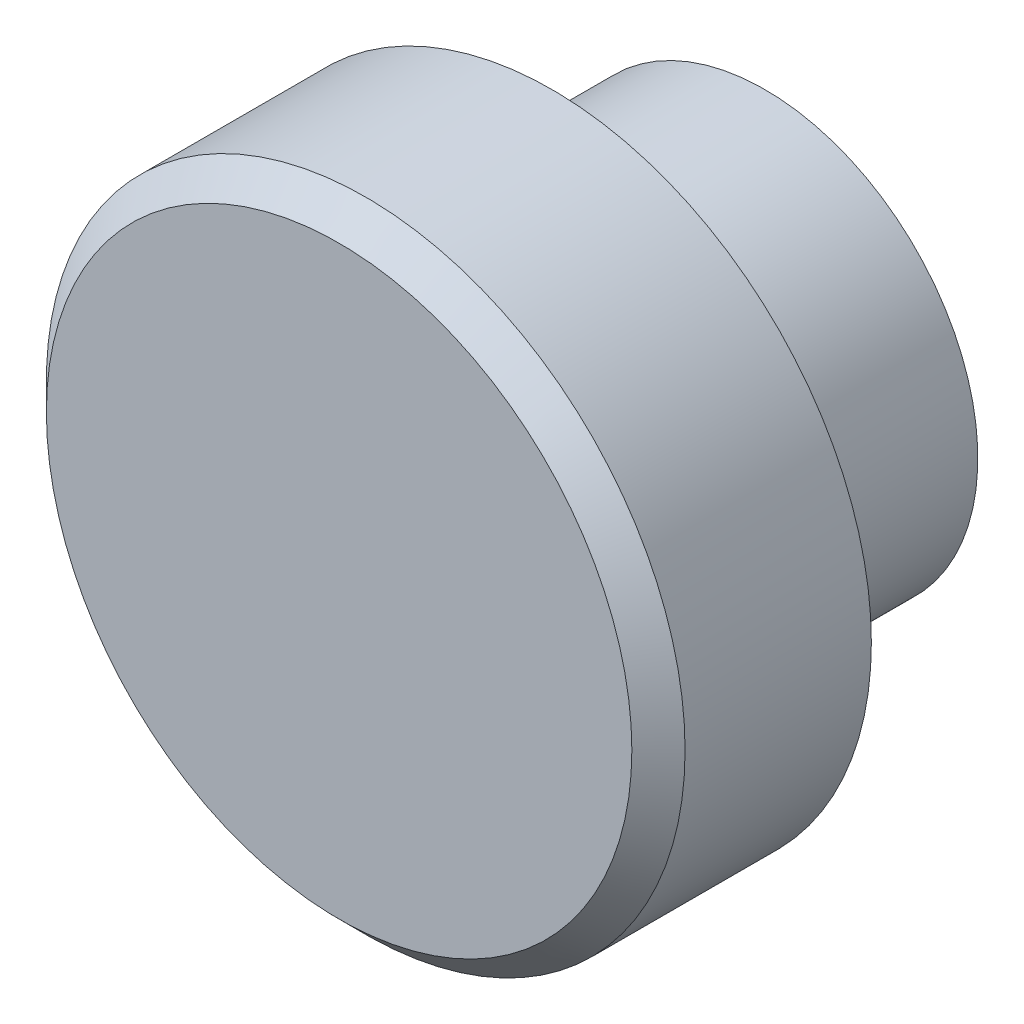
ISO-10303-21;
HEADER;
FILE_DESCRIPTION(('STEP AP214'),'2;1');
FILE_NAME('part.step','',(''),(''),'','','');
FILE_SCHEMA(('AUTOMOTIVE_DESIGN { 1 0 10303 214 1 1 1 1 }'));
ENDSEC;
DATA;
#1=APPLICATION_CONTEXT('core data for automotive mechanical design processes');
#2=APPLICATION_PROTOCOL_DEFINITION('international standard','automotive_design',2000,#1);
#3=PRODUCT_CONTEXT('',#1,'mechanical');
#4=PRODUCT('Part','Part','',(#3));
#5=PRODUCT_RELATED_PRODUCT_CATEGORY('part','',(#4));
#6=PRODUCT_DEFINITION_FORMATION('','',#4);
#7=PRODUCT_DEFINITION_CONTEXT('part definition',#1,'design');
#8=PRODUCT_DEFINITION('design','',#6,#7);
#9=PRODUCT_DEFINITION_SHAPE('','',#8);
#10=(LENGTH_UNIT() NAMED_UNIT(*) SI_UNIT(.MILLI.,.METRE.));
#11=(NAMED_UNIT(*) PLANE_ANGLE_UNIT() SI_UNIT($,.RADIAN.));
#12=(NAMED_UNIT(*) SI_UNIT($,.STERADIAN.) SOLID_ANGLE_UNIT());
#13=UNCERTAINTY_MEASURE_WITH_UNIT(LENGTH_MEASURE(1.E-05),#10,'distance_accuracy_value','');
#14=(GEOMETRIC_REPRESENTATION_CONTEXT(3) GLOBAL_UNCERTAINTY_ASSIGNED_CONTEXT((#13)) GLOBAL_UNIT_ASSIGNED_CONTEXT((#10,
#11,#12)) REPRESENTATION_CONTEXT('',''));
#15=CARTESIAN_POINT('',(0.,0.,0.));
#16=DIRECTION('',(0.,0.,1.));
#17=DIRECTION('',(1.,0.,0.));
#18=AXIS2_PLACEMENT_3D('',#15,#16,#17);
#19=CARTESIAN_POINT('',(0.,0.,8.));
#20=DIRECTION('',(0.,0.,-1.));
#21=DIRECTION('',(-1.,0.,0.));
#22=AXIS2_PLACEMENT_3D('',#19,#20,#21);
#23=CYLINDRICAL_SURFACE('',#22,12.);
#24=CARTESIAN_POINT('',(0.,0.,7.00000000000001));
#25=DIRECTION('',(0.,0.,1.));
#26=DIRECTION('',(1.,0.,0.));
#27=AXIS2_PLACEMENT_3D('',#24,#25,#26);
#28=CIRCLE('',#27,12.);
#29=CARTESIAN_POINT('',(12.,0.,7.00000000000001));
#30=VERTEX_POINT('',#29);
#31=EDGE_CURVE('E44',#30,#30,#28,.F.);
#32=ORIENTED_EDGE('',*,*,#31,.T.);
#33=EDGE_LOOP('',(#32));
#34=FACE_BOUND('',#33,.T.);
#35=CARTESIAN_POINT('',(0.,0.,0.));
#36=DIRECTION('',(0.,0.,1.));
#37=DIRECTION('',(1.,0.,0.));
#38=AXIS2_PLACEMENT_3D('',#35,#36,#37);
#39=CIRCLE('',#38,12.);
#40=CARTESIAN_POINT('',(12.,0.,0.));
#41=VERTEX_POINT('',#40);
#42=EDGE_CURVE('E58',#41,#41,#39,.T.);
#43=ORIENTED_EDGE('',*,*,#42,.T.);
#44=EDGE_LOOP('',(#43));
#45=FACE_BOUND('',#44,.T.);
#46=ADVANCED_FACE('F39',(#34,#45),#23,.T.);
#47=CARTESIAN_POINT('',(0.,0.,8.));
#48=DIRECTION('',(0.,0.,1.));
#49=DIRECTION('',(1.,0.,0.));
#50=AXIS2_PLACEMENT_3D('',#47,#48,#49);
#51=PLANE('',#50);
#52=CARTESIAN_POINT('',(0.,0.,8.));
#53=DIRECTION('',(0.,0.,1.));
#54=DIRECTION('',(1.,0.,0.));
#55=AXIS2_PLACEMENT_3D('',#52,#53,#54);
#56=CIRCLE('',#55,11.);
#57=CARTESIAN_POINT('',(11.,0.,8.));
#58=VERTEX_POINT('',#57);
#59=EDGE_CURVE('E54',#58,#58,#56,.T.);
#60=ORIENTED_EDGE('',*,*,#59,.T.);
#61=EDGE_LOOP('',(#60));
#62=FACE_BOUND('',#61,.T.);
#63=ADVANCED_FACE('F65',(#62),#51,.T.);
#64=CARTESIAN_POINT('',(0.,0.,0.));
#65=DIRECTION('',(0.,0.,1.));
#66=DIRECTION('',(1.,0.,0.));
#67=AXIS2_PLACEMENT_3D('',#64,#65,#66);
#68=PLANE('',#67);
#69=CARTESIAN_POINT('',(0.,0.,0.));
#70=DIRECTION('',(0.,0.,-1.));
#71=DIRECTION('',(-1.,0.,0.));
#72=AXIS2_PLACEMENT_3D('',#69,#70,#71);
#73=CIRCLE('',#72,8.);
#74=CARTESIAN_POINT('',(-8.,0.,0.));
#75=VERTEX_POINT('',#74);
#76=EDGE_CURVE('E10',#75,#75,#73,.T.);
#77=ORIENTED_EDGE('',*,*,#76,.F.);
#78=EDGE_LOOP('',(#77));
#79=FACE_BOUND('',#78,.T.);
#80=ORIENTED_EDGE('',*,*,#42,.F.);
#81=EDGE_LOOP('',(#80));
#82=FACE_BOUND('',#81,.T.);
#83=ADVANCED_FACE('F69',(#79,#82),#68,.F.);
#84=CARTESIAN_POINT('',(0.,0.,8.));
#85=DIRECTION('',(0.,0.,-1.));
#86=DIRECTION('',(-1.,0.,0.));
#87=AXIS2_PLACEMENT_3D('',#84,#85,#86);
#88=CONICAL_SURFACE('',#87,11.,0.785398163397447);
#89=ORIENTED_EDGE('',*,*,#31,.F.);
#90=EDGE_LOOP('',(#89));
#91=FACE_BOUND('',#90,.T.);
#92=ORIENTED_EDGE('',*,*,#59,.F.);
#93=EDGE_LOOP('',(#92));
#94=FACE_BOUND('',#93,.T.);
#95=ADVANCED_FACE('F42',(#91,#94),#88,.T.);
#96=CARTESIAN_POINT('',(0.,0.,-8.));
#97=DIRECTION('',(0.,0.,1.));
#98=DIRECTION('',(1.,0.,0.));
#99=AXIS2_PLACEMENT_3D('',#96,#97,#98);
#100=CYLINDRICAL_SURFACE('',#99,8.);
#101=CARTESIAN_POINT('',(0.,0.,-8.));
#102=DIRECTION('',(0.,0.,-1.));
#103=DIRECTION('',(-1.,0.,0.));
#104=AXIS2_PLACEMENT_3D('',#101,#102,#103);
#105=CIRCLE('',#104,8.);
#106=CARTESIAN_POINT('',(-8.,0.,-8.));
#107=VERTEX_POINT('',#106);
#108=EDGE_CURVE('E57',#107,#107,#105,.T.);
#109=ORIENTED_EDGE('',*,*,#108,.F.);
#110=EDGE_LOOP('',(#109));
#111=FACE_BOUND('',#110,.T.);
#112=ORIENTED_EDGE('',*,*,#76,.T.);
#113=EDGE_LOOP('',(#112));
#114=FACE_BOUND('',#113,.T.);
#115=ADVANCED_FACE('F68',(#111,#114),#100,.T.);
#116=CARTESIAN_POINT('',(0.,0.,-8.));
#117=DIRECTION('',(0.,0.,-1.));
#118=DIRECTION('',(-1.,0.,0.));
#119=AXIS2_PLACEMENT_3D('',#116,#117,#118);
#120=PLANE('',#119);
#121=ORIENTED_EDGE('',*,*,#108,.T.);
#122=EDGE_LOOP('',(#121));
#123=FACE_BOUND('',#122,.T.);
#124=ADVANCED_FACE('F75',(#123),#120,.T.);
#125=CLOSED_SHELL('',(#46,#63,#83,#95,#115,#124));
#126=MANIFOLD_SOLID_BREP('B2',#125);
#127=ADVANCED_BREP_SHAPE_REPRESENTATION('',(#18,#126),#14);
#128=SHAPE_DEFINITION_REPRESENTATION(#9,#127);
ENDSEC;
END-ISO-10303-21;
